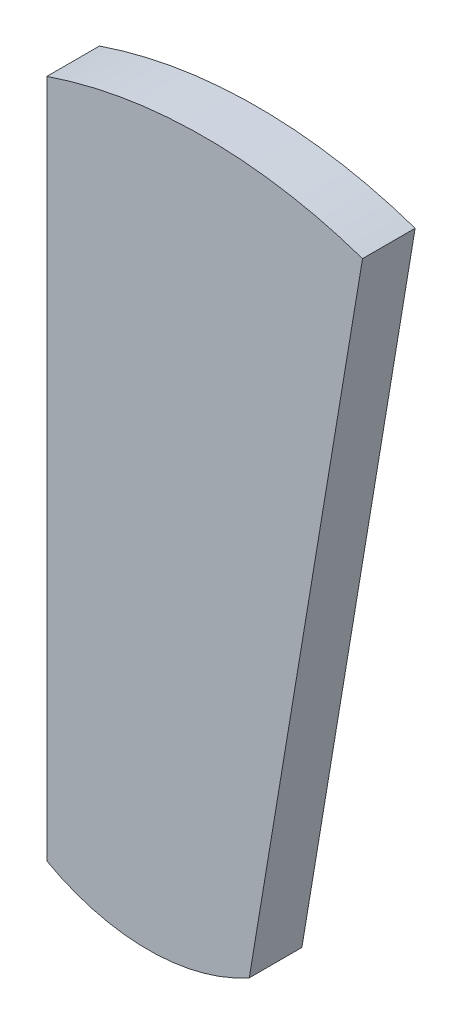
ISO-10303-21;
HEADER;
FILE_DESCRIPTION(('STEP AP214'),'2;1');
FILE_NAME('part.step','',(''),(''),'','','');
FILE_SCHEMA(('AUTOMOTIVE_DESIGN { 1 0 10303 214 1 1 1 1 }'));
ENDSEC;
DATA;
#1=APPLICATION_CONTEXT('core data for automotive mechanical design processes');
#2=APPLICATION_PROTOCOL_DEFINITION('international standard','automotive_design',2000,#1);
#3=PRODUCT_CONTEXT('',#1,'mechanical');
#4=PRODUCT('Part','Part','',(#3));
#5=PRODUCT_RELATED_PRODUCT_CATEGORY('part','',(#4));
#6=PRODUCT_DEFINITION_FORMATION('','',#4);
#7=PRODUCT_DEFINITION_CONTEXT('part definition',#1,'design');
#8=PRODUCT_DEFINITION('design','',#6,#7);
#9=PRODUCT_DEFINITION_SHAPE('','',#8);
#10=(LENGTH_UNIT() NAMED_UNIT(*) SI_UNIT(.MILLI.,.METRE.));
#11=(NAMED_UNIT(*) PLANE_ANGLE_UNIT() SI_UNIT($,.RADIAN.));
#12=(NAMED_UNIT(*) SI_UNIT($,.STERADIAN.) SOLID_ANGLE_UNIT());
#13=UNCERTAINTY_MEASURE_WITH_UNIT(LENGTH_MEASURE(1.E-05),#10,'distance_accuracy_value','');
#14=(GEOMETRIC_REPRESENTATION_CONTEXT(3) GLOBAL_UNCERTAINTY_ASSIGNED_CONTEXT((#13)) GLOBAL_UNIT_ASSIGNED_CONTEXT((#10,
#11,#12)) REPRESENTATION_CONTEXT('',''));
#15=CARTESIAN_POINT('',(0.,0.,0.));
#16=DIRECTION('',(0.,0.,1.));
#17=DIRECTION('',(1.,0.,0.));
#18=AXIS2_PLACEMENT_3D('',#15,#16,#17);
#19=CARTESIAN_POINT('',(-18.,-17.7335524314327,3.));
#20=DIRECTION('',(0.,0.,-1.));
#21=DIRECTION('',(-1.,0.,0.));
#22=AXIS2_PLACEMENT_3D('',#19,#20,#21);
#23=CYLINDRICAL_SURFACE('',#22,55.4970781807185);
#24=CARTESIAN_POINT('',(-18.,-17.7335524314327,-3.));
#25=DIRECTION('',(0.,0.,1.));
#26=DIRECTION('',(1.,0.,0.));
#27=AXIS2_PLACEMENT_3D('',#24,#25,#26);
#28=CIRCLE('',#27,55.4970781807185);
#29=CARTESIAN_POINT('',(-36.,34.7633587786259,-3.));
#30=VERTEX_POINT('',#29);
#31=CARTESIAN_POINT('',(0.,34.7633587786259,-3.));
#32=VERTEX_POINT('',#31);
#33=EDGE_CURVE('E104',#30,#32,#28,.F.);
#34=ORIENTED_EDGE('',*,*,#33,.F.);
#35=DIRECTION('',(0.,0.,-1.));
#36=VECTOR('',#35,1.);
#37=CARTESIAN_POINT('',(-36.,34.7633587786259,3.));
#38=LINE('',#37,#36);
#39=CARTESIAN_POINT('',(-36.,34.7633587786259,3.));
#40=VERTEX_POINT('',#39);
#41=EDGE_CURVE('E11',#40,#30,#38,.T.);
#42=ORIENTED_EDGE('',*,*,#41,.F.);
#43=CARTESIAN_POINT('',(-18.,-17.7335524314327,3.));
#44=DIRECTION('',(0.,0.,1.));
#45=DIRECTION('',(1.,0.,0.));
#46=AXIS2_PLACEMENT_3D('',#43,#44,#45);
#47=CIRCLE('',#46,55.4970781807185);
#48=CARTESIAN_POINT('',(0.,34.7633587786259,3.));
#49=VERTEX_POINT('',#48);
#50=EDGE_CURVE('E92',#40,#49,#47,.F.);
#51=ORIENTED_EDGE('',*,*,#50,.T.);
#52=DIRECTION('',(0.,0.,-1.));
#53=VECTOR('',#52,1.);
#54=CARTESIAN_POINT('',(0.,34.7633587786259,3.));
#55=LINE('',#54,#53);
#56=EDGE_CURVE('E81',#49,#32,#55,.T.);
#57=ORIENTED_EDGE('',*,*,#56,.T.);
#58=EDGE_LOOP('',(#34,#42,#51,#57));
#59=FACE_BOUND('',#58,.T.);
#60=ADVANCED_FACE('F42',(#59),#23,.T.);
#61=CARTESIAN_POINT('',(-36.,0.,3.));
#62=DIRECTION('',(1.,0.,0.));
#63=DIRECTION('',(0.,0.,-1.));
#64=AXIS2_PLACEMENT_3D('',#61,#62,#63);
#65=PLANE('',#64);
#66=DIRECTION('',(0.,-1.,0.));
#67=VECTOR('',#66,1.);
#68=CARTESIAN_POINT('',(-36.,0.,-3.));
#69=LINE('',#68,#67);
#70=CARTESIAN_POINT('',(-36.,-42.7328244274809,-3.));
#71=VERTEX_POINT('',#70);
#72=EDGE_CURVE('E97',#30,#71,#69,.T.);
#73=ORIENTED_EDGE('',*,*,#72,.T.);
#74=DIRECTION('',(0.,0.,-1.));
#75=VECTOR('',#74,1.);
#76=CARTESIAN_POINT('',(-36.,-42.7328244274809,3.));
#77=LINE('',#76,#75);
#78=CARTESIAN_POINT('',(-36.,-42.7328244274809,3.));
#79=VERTEX_POINT('',#78);
#80=EDGE_CURVE('E50',#79,#71,#77,.T.);
#81=ORIENTED_EDGE('',*,*,#80,.F.);
#82=DIRECTION('',(0.,-1.,0.));
#83=VECTOR('',#82,1.);
#84=CARTESIAN_POINT('',(-36.,0.,3.));
#85=LINE('',#84,#83);
#86=EDGE_CURVE('E87',#40,#79,#85,.T.);
#87=ORIENTED_EDGE('',*,*,#86,.F.);
#88=ORIENTED_EDGE('',*,*,#41,.T.);
#89=EDGE_LOOP('',(#73,#81,#87,#88));
#90=FACE_BOUND('',#89,.T.);
#91=ADVANCED_FACE('F95',(#90),#65,.F.);
#92=CARTESIAN_POINT('',(-24.4580152671759,-22.0299354613044,3.));
#93=DIRECTION('',(0.,0.,-1.));
#94=DIRECTION('',(-1.,0.,0.));
#95=AXIS2_PLACEMENT_3D('',#92,#93,#94);
#96=CYLINDRICAL_SURFACE('',#95,23.7028906068137);
#97=CARTESIAN_POINT('',(-24.4580152671759,-22.0299354613044,-3.));
#98=DIRECTION('',(0.,0.,1.));
#99=DIRECTION('',(1.,0.,0.));
#100=AXIS2_PLACEMENT_3D('',#97,#98,#99);
#101=CIRCLE('',#100,23.7028906068137);
#102=CARTESIAN_POINT('',(-12.9160305343511,-42.7328244274805,-3.));
#103=VERTEX_POINT('',#102);
#104=EDGE_CURVE('E74',#71,#103,#101,.T.);
#105=ORIENTED_EDGE('',*,*,#104,.T.);
#106=DIRECTION('',(0.,0.,-1.));
#107=VECTOR('',#106,1.);
#108=CARTESIAN_POINT('',(-12.9160305343511,-42.7328244274805,3.));
#109=LINE('',#108,#107);
#110=CARTESIAN_POINT('',(-12.9160305343511,-42.7328244274805,3.));
#111=VERTEX_POINT('',#110);
#112=EDGE_CURVE('E98',#111,#103,#109,.T.);
#113=ORIENTED_EDGE('',*,*,#112,.F.);
#114=CARTESIAN_POINT('',(-24.4580152671759,-22.0299354613044,3.));
#115=DIRECTION('',(0.,0.,1.));
#116=DIRECTION('',(1.,0.,0.));
#117=AXIS2_PLACEMENT_3D('',#114,#115,#116);
#118=CIRCLE('',#117,23.7028906068137);
#119=EDGE_CURVE('E91',#79,#111,#118,.T.);
#120=ORIENTED_EDGE('',*,*,#119,.F.);
#121=ORIENTED_EDGE('',*,*,#80,.T.);
#122=EDGE_LOOP('',(#105,#113,#120,#121));
#123=FACE_BOUND('',#122,.T.);
#124=ADVANCED_FACE('F99',(#123),#96,.T.);
#125=CARTESIAN_POINT('',(-5.63730142356097,0.939550237260163,3.));
#126=DIRECTION('',(-0.986393923832144,0.164398987305358,0.));
#127=DIRECTION('',(-0.164398987305358,-0.986393923832144,0.));
#128=AXIS2_PLACEMENT_3D('',#125,#126,#127);
#129=PLANE('',#128);
#130=DIRECTION('',(0.164398987305358,0.986393923832144,0.));
#131=VECTOR('',#130,1.);
#132=CARTESIAN_POINT('',(-5.63730142356097,0.939550237260163,-3.));
#133=LINE('',#132,#131);
#134=EDGE_CURVE('E109',#103,#32,#133,.T.);
#135=ORIENTED_EDGE('',*,*,#134,.T.);
#136=ORIENTED_EDGE('',*,*,#56,.F.);
#137=DIRECTION('',(0.164398987305358,0.986393923832144,0.));
#138=VECTOR('',#137,1.);
#139=CARTESIAN_POINT('',(-5.63730142356097,0.939550237260163,3.));
#140=LINE('',#139,#138);
#141=EDGE_CURVE('E58',#111,#49,#140,.T.);
#142=ORIENTED_EDGE('',*,*,#141,.F.);
#143=ORIENTED_EDGE('',*,*,#112,.T.);
#144=EDGE_LOOP('',(#135,#136,#142,#143));
#145=FACE_BOUND('',#144,.T.);
#146=ADVANCED_FACE('F114',(#145),#129,.F.);
#147=CARTESIAN_POINT('',(0.,0.,3.));
#148=DIRECTION('',(0.,0.,1.));
#149=DIRECTION('',(1.,0.,0.));
#150=AXIS2_PLACEMENT_3D('',#147,#148,#149);
#151=PLANE('',#150);
#152=ORIENTED_EDGE('',*,*,#50,.F.);
#153=ORIENTED_EDGE('',*,*,#86,.T.);
#154=ORIENTED_EDGE('',*,*,#119,.T.);
#155=ORIENTED_EDGE('',*,*,#141,.T.);
#156=EDGE_LOOP('',(#152,#153,#154,#155));
#157=FACE_BOUND('',#156,.T.);
#158=ADVANCED_FACE('F89',(#157),#151,.T.);
#159=CARTESIAN_POINT('',(0.,0.,-3.));
#160=DIRECTION('',(0.,0.,1.));
#161=DIRECTION('',(1.,0.,0.));
#162=AXIS2_PLACEMENT_3D('',#159,#160,#161);
#163=PLANE('',#162);
#164=ORIENTED_EDGE('',*,*,#33,.T.);
#165=ORIENTED_EDGE('',*,*,#134,.F.);
#166=ORIENTED_EDGE('',*,*,#104,.F.);
#167=ORIENTED_EDGE('',*,*,#72,.F.);
#168=EDGE_LOOP('',(#164,#165,#166,#167));
#169=FACE_BOUND('',#168,.T.);
#170=ADVANCED_FACE('F116',(#169),#163,.F.);
#171=CLOSED_SHELL('',(#60,#91,#124,#146,#158,#170));
#172=MANIFOLD_SOLID_BREP('B2',#171);
#173=ADVANCED_BREP_SHAPE_REPRESENTATION('',(#18,#172),#14);
#174=SHAPE_DEFINITION_REPRESENTATION(#9,#173);
ENDSEC;
END-ISO-10303-21;
